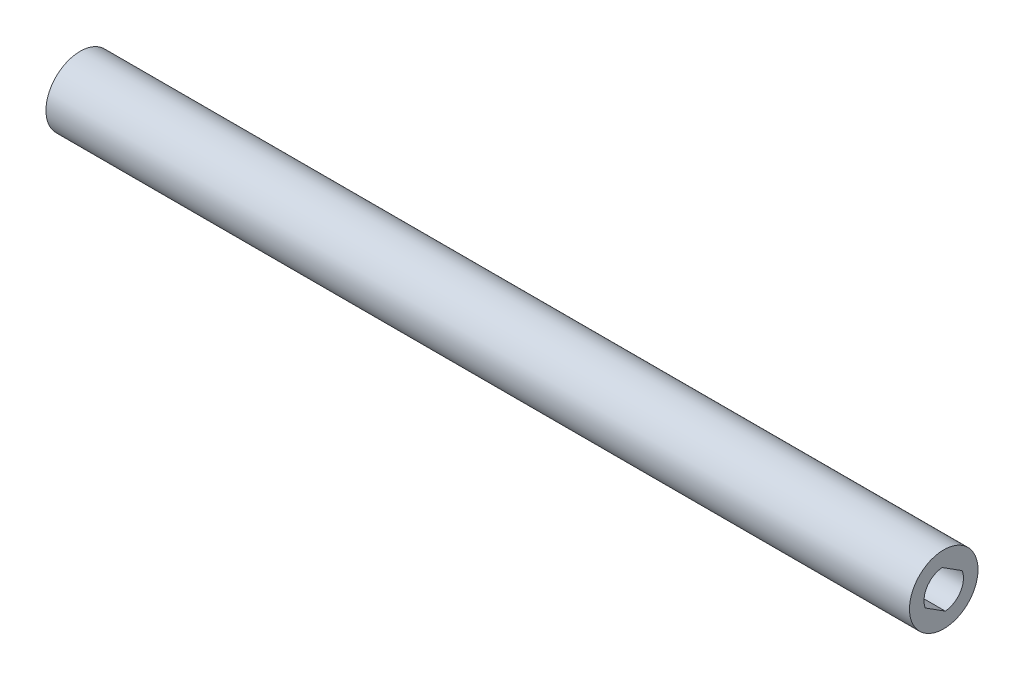
ISO-10303-21;
HEADER;
FILE_DESCRIPTION(('STEP AP214'),'2;1');
FILE_NAME('part.step','',(''),(''),'','','');
FILE_SCHEMA(('AUTOMOTIVE_DESIGN { 1 0 10303 214 1 1 1 1 }'));
ENDSEC;
DATA;
#1=APPLICATION_CONTEXT('core data for automotive mechanical design processes');
#2=APPLICATION_PROTOCOL_DEFINITION('international standard','automotive_design',2000,#1);
#3=PRODUCT_CONTEXT('',#1,'mechanical');
#4=PRODUCT('Part','Part','',(#3));
#5=PRODUCT_RELATED_PRODUCT_CATEGORY('part','',(#4));
#6=PRODUCT_DEFINITION_FORMATION('','',#4);
#7=PRODUCT_DEFINITION_CONTEXT('part definition',#1,'design');
#8=PRODUCT_DEFINITION('design','',#6,#7);
#9=PRODUCT_DEFINITION_SHAPE('','',#8);
#10=(LENGTH_UNIT() NAMED_UNIT(*) SI_UNIT(.MILLI.,.METRE.));
#11=(NAMED_UNIT(*) PLANE_ANGLE_UNIT() SI_UNIT($,.RADIAN.));
#12=(NAMED_UNIT(*) SI_UNIT($,.STERADIAN.) SOLID_ANGLE_UNIT());
#13=UNCERTAINTY_MEASURE_WITH_UNIT(LENGTH_MEASURE(1.E-05),#10,'distance_accuracy_value','');
#14=(GEOMETRIC_REPRESENTATION_CONTEXT(3) GLOBAL_UNCERTAINTY_ASSIGNED_CONTEXT((#13)) GLOBAL_UNIT_ASSIGNED_CONTEXT((#10,
#11,#12)) REPRESENTATION_CONTEXT('',''));
#15=CARTESIAN_POINT('',(0.,0.,0.));
#16=DIRECTION('',(0.,0.,1.));
#17=DIRECTION('',(1.,0.,0.));
#18=AXIS2_PLACEMENT_3D('',#15,#16,#17);
#19=CARTESIAN_POINT('',(126.,0.,0.));
#20=DIRECTION('',(-1.,0.,0.));
#21=DIRECTION('',(0.,0.,1.));
#22=AXIS2_PLACEMENT_3D('',#19,#20,#21);
#23=CYLINDRICAL_SURFACE('',#22,5.);
#24=CARTESIAN_POINT('',(126.,0.,0.));
#25=DIRECTION('',(1.,0.,0.));
#26=DIRECTION('',(0.,0.,-1.));
#27=AXIS2_PLACEMENT_3D('',#24,#25,#26);
#28=CIRCLE('',#27,5.);
#29=CARTESIAN_POINT('',(126.,0.,-5.));
#30=VERTEX_POINT('',#29);
#31=EDGE_CURVE('E11',#30,#30,#28,.T.);
#32=ORIENTED_EDGE('',*,*,#31,.F.);
#33=EDGE_LOOP('',(#32));
#34=FACE_BOUND('',#33,.T.);
#35=CARTESIAN_POINT('',(0.,0.,0.));
#36=DIRECTION('',(1.,0.,0.));
#37=DIRECTION('',(0.,0.,-1.));
#38=AXIS2_PLACEMENT_3D('',#35,#36,#37);
#39=CIRCLE('',#38,5.);
#40=CARTESIAN_POINT('',(0.,0.,-5.));
#41=VERTEX_POINT('',#40);
#42=EDGE_CURVE('E42',#41,#41,#39,.T.);
#43=ORIENTED_EDGE('',*,*,#42,.T.);
#44=EDGE_LOOP('',(#43));
#45=FACE_BOUND('',#44,.T.);
#46=ADVANCED_FACE('F41',(#34,#45),#23,.T.);
#47=CARTESIAN_POINT('',(126.,0.,0.));
#48=DIRECTION('',(1.,0.,0.));
#49=DIRECTION('',(0.,0.,-1.));
#50=AXIS2_PLACEMENT_3D('',#47,#48,#49);
#51=PLANE('',#50);
#52=CARTESIAN_POINT('',(126.,0.,0.));
#53=DIRECTION('',(1.,0.,0.));
#54=DIRECTION('',(0.,0.,-1.));
#55=AXIS2_PLACEMENT_3D('',#52,#53,#54);
#56=CIRCLE('',#55,2.87500000000047);
#57=CARTESIAN_POINT('',(126.,2.86612509240006,0.225725396704413));
#58=VERTEX_POINT('',#57);
#59=CARTESIAN_POINT('',(126.,-1.01921140670716,2.68827697762719));
#60=VERTEX_POINT('',#59);
#61=EDGE_CURVE('E64',#58,#60,#56,.T.);
#62=ORIENTED_EDGE('',*,*,#61,.F.);
#63=DIRECTION('',(0.,0.535337300201691,0.844638369370445));
#64=VECTOR('',#63,1.);
#65=CARTESIAN_POINT('',(126.,1.01921140670106,-2.68827697762862));
#66=LINE('',#65,#64);
#67=CARTESIAN_POINT('',(126.,1.01921140670106,-2.68827697762862));
#68=VERTEX_POINT('',#67);
#69=EDGE_CURVE('E150',#68,#58,#66,.T.);
#70=ORIENTED_EDGE('',*,*,#69,.F.);
#71=CARTESIAN_POINT('',(126.,0.,0.));
#72=DIRECTION('',(1.,0.,0.));
#73=DIRECTION('',(0.,0.,-1.));
#74=AXIS2_PLACEMENT_3D('',#71,#72,#73);
#75=CIRCLE('',#74,2.87499999999953);
#76=CARTESIAN_POINT('',(126.,-2.86612509239982,-0.225725396695843));
#77=VERTEX_POINT('',#76);
#78=EDGE_CURVE('E161',#77,#68,#75,.T.);
#79=ORIENTED_EDGE('',*,*,#78,.F.);
#80=DIRECTION('',(0.,-0.53533730020169,-0.844638369370445));
#81=VECTOR('',#80,1.);
#82=CARTESIAN_POINT('',(126.,-1.01921140670716,2.68827697762719));
#83=LINE('',#82,#81);
#84=EDGE_CURVE('E158',#60,#77,#83,.T.);
#85=ORIENTED_EDGE('',*,*,#84,.F.);
#86=EDGE_LOOP('',(#62,#70,#79,#85));
#87=FACE_BOUND('',#86,.T.);
#88=ORIENTED_EDGE('',*,*,#31,.T.);
#89=EDGE_LOOP('',(#88));
#90=FACE_BOUND('',#89,.T.);
#91=ADVANCED_FACE('F178',(#87,#90),#51,.T.);
#92=CARTESIAN_POINT('',(0.,0.,0.));
#93=DIRECTION('',(1.,0.,0.));
#94=DIRECTION('',(0.,0.,-1.));
#95=AXIS2_PLACEMENT_3D('',#92,#93,#94);
#96=PLANE('',#95);
#97=DIRECTION('',(0.,-0.535337300201691,-0.844638369370445));
#98=VECTOR('',#97,1.);
#99=CARTESIAN_POINT('',(0.,2.86612509239995,0.225725396703636));
#100=LINE('',#99,#98);
#101=CARTESIAN_POINT('',(0.,2.86612509239995,0.225725396703635));
#102=VERTEX_POINT('',#101);
#103=CARTESIAN_POINT('',(0.,1.01921140670141,-2.68827697762867));
#104=VERTEX_POINT('',#103);
#105=EDGE_CURVE('E133',#102,#104,#100,.T.);
#106=ORIENTED_EDGE('',*,*,#105,.F.);
#107=CARTESIAN_POINT('',(0.,0.,0.));
#108=DIRECTION('',(-1.,0.,0.));
#109=DIRECTION('',(0.,0.,1.));
#110=AXIS2_PLACEMENT_3D('',#107,#108,#109);
#111=CIRCLE('',#110,2.8750000000003);
#112=CARTESIAN_POINT('',(0.,-1.01921140670681,2.68827697762715));
#113=VERTEX_POINT('',#112);
#114=EDGE_CURVE('E54',#113,#102,#111,.T.);
#115=ORIENTED_EDGE('',*,*,#114,.F.);
#116=DIRECTION('',(0.,0.535337300201691,0.844638369370445));
#117=VECTOR('',#116,1.);
#118=CARTESIAN_POINT('',(0.,-2.86612509239993,-0.225725396696615));
#119=LINE('',#118,#117);
#120=CARTESIAN_POINT('',(0.,-2.86612509239993,-0.225725396696615));
#121=VERTEX_POINT('',#120);
#122=EDGE_CURVE('E125',#121,#113,#119,.T.);
#123=ORIENTED_EDGE('',*,*,#122,.F.);
#124=CARTESIAN_POINT('',(0.,0.,0.));
#125=DIRECTION('',(-1.,0.,0.));
#126=DIRECTION('',(0.,0.,1.));
#127=AXIS2_PLACEMENT_3D('',#124,#125,#126);
#128=CIRCLE('',#127,2.8749999999997);
#129=EDGE_CURVE('E126',#104,#121,#128,.T.);
#130=ORIENTED_EDGE('',*,*,#129,.F.);
#131=EDGE_LOOP('',(#106,#115,#123,#130));
#132=FACE_BOUND('',#131,.T.);
#133=ORIENTED_EDGE('',*,*,#42,.F.);
#134=EDGE_LOOP('',(#133));
#135=FACE_BOUND('',#134,.T.);
#136=ADVANCED_FACE('F196',(#132,#135),#96,.F.);
#137=CARTESIAN_POINT('',(118.,0.,0.));
#138=DIRECTION('',(1.,0.,0.));
#139=DIRECTION('',(0.,0.,-1.));
#140=AXIS2_PLACEMENT_3D('',#137,#138,#139);
#141=CYLINDRICAL_SURFACE('',#140,2.87500000000047);
#142=ORIENTED_EDGE('',*,*,#61,.T.);
#143=DIRECTION('',(1.,0.,0.));
#144=VECTOR('',#143,1.);
#145=CARTESIAN_POINT('',(118.,-1.01921140670716,2.68827697762719));
#146=LINE('',#145,#144);
#147=CARTESIAN_POINT('',(118.,-1.01921140670716,2.68827697762719));
#148=VERTEX_POINT('',#147);
#149=EDGE_CURVE('E156',#148,#60,#146,.T.);
#150=ORIENTED_EDGE('',*,*,#149,.F.);
#151=CARTESIAN_POINT('',(118.,0.,0.));
#152=DIRECTION('',(1.,0.,0.));
#153=DIRECTION('',(0.,0.,-1.));
#154=AXIS2_PLACEMENT_3D('',#151,#152,#153);
#155=CIRCLE('',#154,2.87500000000047);
#156=CARTESIAN_POINT('',(118.,2.86612509240006,0.225725396704413));
#157=VERTEX_POINT('',#156);
#158=EDGE_CURVE('E141',#157,#148,#155,.T.);
#159=ORIENTED_EDGE('',*,*,#158,.F.);
#160=DIRECTION('',(1.,0.,0.));
#161=VECTOR('',#160,1.);
#162=CARTESIAN_POINT('',(118.,2.86612509240006,0.225725396704413));
#163=LINE('',#162,#161);
#164=EDGE_CURVE('E167',#157,#58,#163,.T.);
#165=ORIENTED_EDGE('',*,*,#164,.T.);
#166=EDGE_LOOP('',(#142,#150,#159,#165));
#167=FACE_BOUND('',#166,.T.);
#168=ADVANCED_FACE('F189',(#167),#141,.F.);
#169=CARTESIAN_POINT('',(118.,1.01921140670106,-2.68827697762862));
#170=DIRECTION('',(0.,0.844638369370445,-0.535337300201691));
#171=DIRECTION('',(0.,0.535337300201691,0.844638369370445));
#172=AXIS2_PLACEMENT_3D('',#169,#170,#171);
#173=PLANE('',#172);
#174=ORIENTED_EDGE('',*,*,#69,.T.);
#175=ORIENTED_EDGE('',*,*,#164,.F.);
#176=DIRECTION('',(0.,0.535337300201691,0.844638369370445));
#177=VECTOR('',#176,1.);
#178=CARTESIAN_POINT('',(118.,1.01921140670106,-2.68827697762862));
#179=LINE('',#178,#177);
#180=CARTESIAN_POINT('',(118.,1.01921140670106,-2.68827697762862));
#181=VERTEX_POINT('',#180);
#182=EDGE_CURVE('E153',#181,#157,#179,.T.);
#183=ORIENTED_EDGE('',*,*,#182,.F.);
#184=DIRECTION('',(1.,0.,0.));
#185=VECTOR('',#184,1.);
#186=CARTESIAN_POINT('',(118.,1.01921140670106,-2.68827697762862));
#187=LINE('',#186,#185);
#188=EDGE_CURVE('E169',#181,#68,#187,.T.);
#189=ORIENTED_EDGE('',*,*,#188,.T.);
#190=EDGE_LOOP('',(#174,#175,#183,#189));
#191=FACE_BOUND('',#190,.T.);
#192=ADVANCED_FACE('F190',(#191),#173,.F.);
#193=CARTESIAN_POINT('',(118.,0.,0.));
#194=DIRECTION('',(1.,0.,0.));
#195=DIRECTION('',(0.,0.,-1.));
#196=AXIS2_PLACEMENT_3D('',#193,#194,#195);
#197=CYLINDRICAL_SURFACE('',#196,2.87499999999953);
#198=ORIENTED_EDGE('',*,*,#78,.T.);
#199=ORIENTED_EDGE('',*,*,#188,.F.);
#200=CARTESIAN_POINT('',(118.,0.,0.));
#201=DIRECTION('',(1.,0.,0.));
#202=DIRECTION('',(0.,0.,-1.));
#203=AXIS2_PLACEMENT_3D('',#200,#201,#202);
#204=CIRCLE('',#203,2.87499999999953);
#205=CARTESIAN_POINT('',(118.,-2.86612509239982,-0.225725396695843));
#206=VERTEX_POINT('',#205);
#207=EDGE_CURVE('E147',#206,#181,#204,.T.);
#208=ORIENTED_EDGE('',*,*,#207,.F.);
#209=DIRECTION('',(1.,0.,0.));
#210=VECTOR('',#209,1.);
#211=CARTESIAN_POINT('',(118.,-2.86612509239982,-0.225725396695843));
#212=LINE('',#211,#210);
#213=EDGE_CURVE('E168',#206,#77,#212,.T.);
#214=ORIENTED_EDGE('',*,*,#213,.T.);
#215=EDGE_LOOP('',(#198,#199,#208,#214));
#216=FACE_BOUND('',#215,.T.);
#217=ADVANCED_FACE('F181',(#216),#197,.F.);
#218=CARTESIAN_POINT('',(118.,-1.01921140670716,2.68827697762719));
#219=DIRECTION('',(0.,-0.844638369370445,0.53533730020169));
#220=DIRECTION('',(0.,-0.535337300201691,-0.844638369370446));
#221=AXIS2_PLACEMENT_3D('',#218,#219,#220);
#222=PLANE('',#221);
#223=ORIENTED_EDGE('',*,*,#84,.T.);
#224=ORIENTED_EDGE('',*,*,#213,.F.);
#225=DIRECTION('',(0.,-0.53533730020169,-0.844638369370445));
#226=VECTOR('',#225,1.);
#227=CARTESIAN_POINT('',(118.,-1.01921140670716,2.68827697762719));
#228=LINE('',#227,#226);
#229=EDGE_CURVE('E148',#148,#206,#228,.T.);
#230=ORIENTED_EDGE('',*,*,#229,.F.);
#231=ORIENTED_EDGE('',*,*,#149,.T.);
#232=EDGE_LOOP('',(#223,#224,#230,#231));
#233=FACE_BOUND('',#232,.T.);
#234=ADVANCED_FACE('F175',(#233),#222,.F.);
#235=CARTESIAN_POINT('',(118.,0.,0.));
#236=DIRECTION('',(1.,0.,0.));
#237=DIRECTION('',(0.,0.,-1.));
#238=AXIS2_PLACEMENT_3D('',#235,#236,#237);
#239=PLANE('',#238);
#240=ORIENTED_EDGE('',*,*,#158,.T.);
#241=ORIENTED_EDGE('',*,*,#229,.T.);
#242=ORIENTED_EDGE('',*,*,#207,.T.);
#243=ORIENTED_EDGE('',*,*,#182,.T.);
#244=EDGE_LOOP('',(#240,#241,#242,#243));
#245=FACE_BOUND('',#244,.T.);
#246=ADVANCED_FACE('F187',(#245),#239,.T.);
#247=CARTESIAN_POINT('',(8.,0.,0.));
#248=DIRECTION('',(-1.,0.,0.));
#249=DIRECTION('',(0.,0.,1.));
#250=AXIS2_PLACEMENT_3D('',#247,#248,#249);
#251=CYLINDRICAL_SURFACE('',#250,2.8750000000003);
#252=ORIENTED_EDGE('',*,*,#114,.T.);
#253=DIRECTION('',(-1.,0.,0.));
#254=VECTOR('',#253,1.);
#255=CARTESIAN_POINT('',(8.,2.86612509239995,0.225725396703636));
#256=LINE('',#255,#254);
#257=CARTESIAN_POINT('',(8.,2.86612509239995,0.225725396703636));
#258=VERTEX_POINT('',#257);
#259=EDGE_CURVE('E103',#258,#102,#256,.T.);
#260=ORIENTED_EDGE('',*,*,#259,.F.);
#261=CARTESIAN_POINT('',(8.,0.,0.));
#262=DIRECTION('',(-1.,0.,0.));
#263=DIRECTION('',(0.,0.,1.));
#264=AXIS2_PLACEMENT_3D('',#261,#262,#263);
#265=CIRCLE('',#264,2.8750000000003);
#266=CARTESIAN_POINT('',(8.,-1.01921140670681,2.68827697762715));
#267=VERTEX_POINT('',#266);
#268=EDGE_CURVE('E110',#267,#258,#265,.T.);
#269=ORIENTED_EDGE('',*,*,#268,.F.);
#270=DIRECTION('',(-1.,0.,0.));
#271=VECTOR('',#270,1.);
#272=CARTESIAN_POINT('',(8.,-1.01921140670681,2.68827697762715));
#273=LINE('',#272,#271);
#274=EDGE_CURVE('E139',#267,#113,#273,.T.);
#275=ORIENTED_EDGE('',*,*,#274,.T.);
#276=EDGE_LOOP('',(#252,#260,#269,#275));
#277=FACE_BOUND('',#276,.T.);
#278=ADVANCED_FACE('F104',(#277),#251,.F.);
#279=CARTESIAN_POINT('',(8.,-2.86612509239993,-0.225725396696615));
#280=DIRECTION('',(0.,-0.844638369370445,0.535337300201691));
#281=DIRECTION('',(0.,-0.535337300201691,-0.844638369370445));
#282=AXIS2_PLACEMENT_3D('',#279,#280,#281);
#283=PLANE('',#282);
#284=ORIENTED_EDGE('',*,*,#122,.T.);
#285=ORIENTED_EDGE('',*,*,#274,.F.);
#286=DIRECTION('',(0.,0.535337300201691,0.844638369370445));
#287=VECTOR('',#286,1.);
#288=CARTESIAN_POINT('',(8.,-2.86612509239993,-0.225725396696615));
#289=LINE('',#288,#287);
#290=CARTESIAN_POINT('',(8.,-2.86612509239993,-0.225725396696615));
#291=VERTEX_POINT('',#290);
#292=EDGE_CURVE('E114',#291,#267,#289,.T.);
#293=ORIENTED_EDGE('',*,*,#292,.F.);
#294=DIRECTION('',(-1.,0.,0.));
#295=VECTOR('',#294,1.);
#296=CARTESIAN_POINT('',(8.,-2.86612509239993,-0.225725396696615));
#297=LINE('',#296,#295);
#298=EDGE_CURVE('E140',#291,#121,#297,.T.);
#299=ORIENTED_EDGE('',*,*,#298,.T.);
#300=EDGE_LOOP('',(#284,#285,#293,#299));
#301=FACE_BOUND('',#300,.T.);
#302=ADVANCED_FACE('F221',(#301),#283,.F.);
#303=CARTESIAN_POINT('',(8.,0.,0.));
#304=DIRECTION('',(-1.,0.,0.));
#305=DIRECTION('',(0.,0.,1.));
#306=AXIS2_PLACEMENT_3D('',#303,#304,#305);
#307=CYLINDRICAL_SURFACE('',#306,2.8749999999997);
#308=ORIENTED_EDGE('',*,*,#129,.T.);
#309=ORIENTED_EDGE('',*,*,#298,.F.);
#310=CARTESIAN_POINT('',(8.,0.,0.));
#311=DIRECTION('',(-1.,0.,0.));
#312=DIRECTION('',(0.,0.,1.));
#313=AXIS2_PLACEMENT_3D('',#310,#311,#312);
#314=CIRCLE('',#313,2.8749999999997);
#315=CARTESIAN_POINT('',(8.,1.01921140670141,-2.68827697762867));
#316=VERTEX_POINT('',#315);
#317=EDGE_CURVE('E121',#316,#291,#314,.T.);
#318=ORIENTED_EDGE('',*,*,#317,.F.);
#319=DIRECTION('',(-1.,0.,0.));
#320=VECTOR('',#319,1.);
#321=CARTESIAN_POINT('',(8.,1.01921140670141,-2.68827697762867));
#322=LINE('',#321,#320);
#323=EDGE_CURVE('E115',#316,#104,#322,.T.);
#324=ORIENTED_EDGE('',*,*,#323,.T.);
#325=EDGE_LOOP('',(#308,#309,#318,#324));
#326=FACE_BOUND('',#325,.T.);
#327=ADVANCED_FACE('F228',(#326),#307,.F.);
#328=CARTESIAN_POINT('',(8.,2.86612509239995,0.225725396703636));
#329=DIRECTION('',(0.,0.844638369370445,-0.535337300201691));
#330=DIRECTION('',(0.,0.535337300201691,0.844638369370445));
#331=AXIS2_PLACEMENT_3D('',#328,#329,#330);
#332=PLANE('',#331);
#333=ORIENTED_EDGE('',*,*,#105,.T.);
#334=ORIENTED_EDGE('',*,*,#323,.F.);
#335=DIRECTION('',(0.,-0.535337300201691,-0.844638369370445));
#336=VECTOR('',#335,1.);
#337=CARTESIAN_POINT('',(8.,2.86612509239995,0.225725396703636));
#338=LINE('',#337,#336);
#339=EDGE_CURVE('E116',#258,#316,#338,.T.);
#340=ORIENTED_EDGE('',*,*,#339,.F.);
#341=ORIENTED_EDGE('',*,*,#259,.T.);
#342=EDGE_LOOP('',(#333,#334,#340,#341));
#343=FACE_BOUND('',#342,.T.);
#344=ADVANCED_FACE('F117',(#343),#332,.F.);
#345=CARTESIAN_POINT('',(8.,0.,0.));
#346=DIRECTION('',(-1.,0.,0.));
#347=DIRECTION('',(0.,0.,1.));
#348=AXIS2_PLACEMENT_3D('',#345,#346,#347);
#349=PLANE('',#348);
#350=ORIENTED_EDGE('',*,*,#268,.T.);
#351=ORIENTED_EDGE('',*,*,#339,.T.);
#352=ORIENTED_EDGE('',*,*,#317,.T.);
#353=ORIENTED_EDGE('',*,*,#292,.T.);
#354=EDGE_LOOP('',(#350,#351,#352,#353));
#355=FACE_BOUND('',#354,.T.);
#356=ADVANCED_FACE('F124',(#355),#349,.T.);
#357=CLOSED_SHELL('',(#46,#91,#136,#168,#192,#217,#234,#246,#278,#302,#327,#344,#356));
#358=MANIFOLD_SOLID_BREP('B2',#357);
#359=ADVANCED_BREP_SHAPE_REPRESENTATION('',(#18,#358),#14);
#360=SHAPE_DEFINITION_REPRESENTATION(#9,#359);
ENDSEC;
END-ISO-10303-21;
